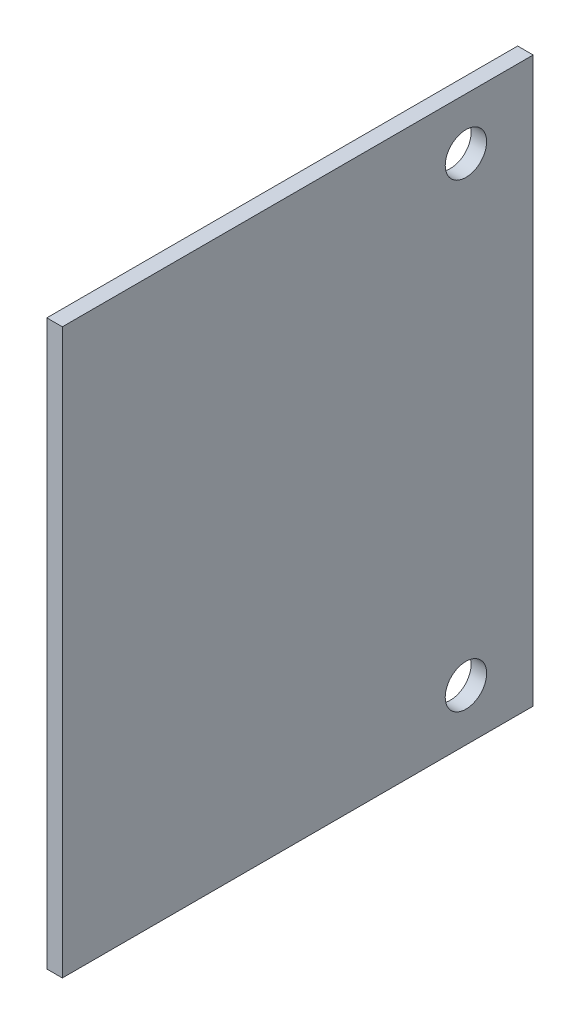
ISO-10303-21;
HEADER;
FILE_DESCRIPTION(('STEP AP214'),'2;1');
FILE_NAME('part.step','',(''),(''),'','','');
FILE_SCHEMA(('AUTOMOTIVE_DESIGN { 1 0 10303 214 1 1 1 1 }'));
ENDSEC;
DATA;
#1=APPLICATION_CONTEXT('core data for automotive mechanical design processes');
#2=APPLICATION_PROTOCOL_DEFINITION('international standard','automotive_design',2000,#1);
#3=PRODUCT_CONTEXT('',#1,'mechanical');
#4=PRODUCT('Part','Part','',(#3));
#5=PRODUCT_RELATED_PRODUCT_CATEGORY('part','',(#4));
#6=PRODUCT_DEFINITION_FORMATION('','',#4);
#7=PRODUCT_DEFINITION_CONTEXT('part definition',#1,'design');
#8=PRODUCT_DEFINITION('design','',#6,#7);
#9=PRODUCT_DEFINITION_SHAPE('','',#8);
#10=(LENGTH_UNIT() NAMED_UNIT(*) SI_UNIT(.MILLI.,.METRE.));
#11=(NAMED_UNIT(*) PLANE_ANGLE_UNIT() SI_UNIT($,.RADIAN.));
#12=(NAMED_UNIT(*) SI_UNIT($,.STERADIAN.) SOLID_ANGLE_UNIT());
#13=UNCERTAINTY_MEASURE_WITH_UNIT(LENGTH_MEASURE(1.E-05),#10,'distance_accuracy_value','');
#14=(GEOMETRIC_REPRESENTATION_CONTEXT(3) GLOBAL_UNCERTAINTY_ASSIGNED_CONTEXT((#13)) GLOBAL_UNIT_ASSIGNED_CONTEXT((#10,
#11,#12)) REPRESENTATION_CONTEXT('',''));
#15=CARTESIAN_POINT('',(0.,0.,0.));
#16=DIRECTION('',(0.,0.,1.));
#17=DIRECTION('',(1.,0.,0.));
#18=AXIS2_PLACEMENT_3D('',#15,#16,#17);
#19=CARTESIAN_POINT('',(-476.25,1289.36392571657,279.4));
#20=DIRECTION('',(1.,0.,0.));
#21=DIRECTION('',(0.,0.,-1.));
#22=AXIS2_PLACEMENT_3D('',#19,#20,#21);
#23=PLANE('',#22);
#24=CARTESIAN_POINT('',(-476.25,628.65,-215.9));
#25=DIRECTION('',(-1.,0.,0.));
#26=DIRECTION('',(0.,0.,1.));
#27=AXIS2_PLACEMENT_3D('',#24,#25,#26);
#28=CIRCLE('',#27,25.4);
#29=CARTESIAN_POINT('',(-476.25,628.65,-190.5));
#30=VERTEX_POINT('',#29);
#31=EDGE_CURVE('E136',#30,#30,#28,.T.);
#32=ORIENTED_EDGE('',*,*,#31,.F.);
#33=EDGE_LOOP('',(#32));
#34=FACE_BOUND('',#33,.T.);
#35=CARTESIAN_POINT('',(-476.25,63.5,-215.9));
#36=DIRECTION('',(-1.,0.,0.));
#37=DIRECTION('',(0.,0.,1.));
#38=AXIS2_PLACEMENT_3D('',#35,#36,#37);
#39=CIRCLE('',#38,25.4);
#40=CARTESIAN_POINT('',(-476.25,63.5,-190.5));
#41=VERTEX_POINT('',#40);
#42=EDGE_CURVE('E132',#41,#41,#39,.T.);
#43=ORIENTED_EDGE('',*,*,#42,.F.);
#44=EDGE_LOOP('',(#43));
#45=FACE_BOUND('',#44,.T.);
#46=DIRECTION('',(0.,0.,1.));
#47=VECTOR('',#46,1.);
#48=CARTESIAN_POINT('',(-476.25,692.15,279.4));
#49=LINE('',#48,#47);
#50=CARTESIAN_POINT('',(-476.25,692.15,-298.45));
#51=VERTEX_POINT('',#50);
#52=CARTESIAN_POINT('',(-476.25,692.15,279.4));
#53=VERTEX_POINT('',#52);
#54=EDGE_CURVE('E91',#51,#53,#49,.T.);
#55=ORIENTED_EDGE('',*,*,#54,.F.);
#56=DIRECTION('',(0.,-1.,0.));
#57=VECTOR('',#56,1.);
#58=CARTESIAN_POINT('',(-476.25,1289.36392571657,-298.45));
#59=LINE('',#58,#57);
#60=CARTESIAN_POINT('',(-476.25,0.,-298.45));
#61=VERTEX_POINT('',#60);
#62=EDGE_CURVE('E44',#51,#61,#59,.T.);
#63=ORIENTED_EDGE('',*,*,#62,.T.);
#64=DIRECTION('',(0.,0.,1.));
#65=VECTOR('',#64,1.);
#66=CARTESIAN_POINT('',(-476.25,0.,279.4));
#67=LINE('',#66,#65);
#68=CARTESIAN_POINT('',(-476.25,0.,279.4));
#69=VERTEX_POINT('',#68);
#70=EDGE_CURVE('E89',#61,#69,#67,.T.);
#71=ORIENTED_EDGE('',*,*,#70,.T.);
#72=DIRECTION('',(0.,-1.,0.));
#73=VECTOR('',#72,1.);
#74=CARTESIAN_POINT('',(-476.25,1289.36392571657,279.4));
#75=LINE('',#74,#73);
#76=EDGE_CURVE('E80',#53,#69,#75,.T.);
#77=ORIENTED_EDGE('',*,*,#76,.F.);
#78=EDGE_LOOP('',(#55,#63,#71,#77));
#79=FACE_BOUND('',#78,.T.);
#80=ADVANCED_FACE('F40',(#34,#45,#79),#23,.F.);
#81=CARTESIAN_POINT('',(-457.2,1289.36392571657,279.4));
#82=DIRECTION('',(0.,0.,-1.));
#83=DIRECTION('',(-1.,0.,0.));
#84=AXIS2_PLACEMENT_3D('',#81,#82,#83);
#85=PLANE('',#84);
#86=DIRECTION('',(1.,0.,0.));
#87=VECTOR('',#86,1.);
#88=CARTESIAN_POINT('',(-457.2,692.15,279.4));
#89=LINE('',#88,#87);
#90=CARTESIAN_POINT('',(-457.2,692.15,279.4));
#91=VERTEX_POINT('',#90);
#92=EDGE_CURVE('E50',#53,#91,#89,.T.);
#93=ORIENTED_EDGE('',*,*,#92,.F.);
#94=ORIENTED_EDGE('',*,*,#76,.T.);
#95=DIRECTION('',(1.,0.,0.));
#96=VECTOR('',#95,1.);
#97=CARTESIAN_POINT('',(-457.2,0.,279.4));
#98=LINE('',#97,#96);
#99=CARTESIAN_POINT('',(-457.2,0.,279.4));
#100=VERTEX_POINT('',#99);
#101=EDGE_CURVE('E104',#69,#100,#98,.T.);
#102=ORIENTED_EDGE('',*,*,#101,.T.);
#103=DIRECTION('',(0.,-1.,0.));
#104=VECTOR('',#103,1.);
#105=CARTESIAN_POINT('',(-457.2,1289.36392571657,279.4));
#106=LINE('',#105,#104);
#107=EDGE_CURVE('E119',#91,#100,#106,.T.);
#108=ORIENTED_EDGE('',*,*,#107,.F.);
#109=EDGE_LOOP('',(#93,#94,#102,#108));
#110=FACE_BOUND('',#109,.T.);
#111=ADVANCED_FACE('F157',(#110),#85,.F.);
#112=CARTESIAN_POINT('',(-457.2,1289.36392571657,-298.45));
#113=DIRECTION('',(-1.,0.,0.));
#114=DIRECTION('',(0.,0.,1.));
#115=AXIS2_PLACEMENT_3D('',#112,#113,#114);
#116=PLANE('',#115);
#117=CARTESIAN_POINT('',(-457.2,628.65,-215.9));
#118=DIRECTION('',(-1.,0.,0.));
#119=DIRECTION('',(0.,0.,1.));
#120=AXIS2_PLACEMENT_3D('',#117,#118,#119);
#121=CIRCLE('',#120,25.4);
#122=CARTESIAN_POINT('',(-457.2,628.65,-190.5));
#123=VERTEX_POINT('',#122);
#124=EDGE_CURVE('E94',#123,#123,#121,.T.);
#125=ORIENTED_EDGE('',*,*,#124,.T.);
#126=EDGE_LOOP('',(#125));
#127=FACE_BOUND('',#126,.T.);
#128=CARTESIAN_POINT('',(-457.2,63.5,-215.9));
#129=DIRECTION('',(-1.,0.,0.));
#130=DIRECTION('',(0.,0.,1.));
#131=AXIS2_PLACEMENT_3D('',#128,#129,#130);
#132=CIRCLE('',#131,25.4);
#133=CARTESIAN_POINT('',(-457.2,63.5,-190.5));
#134=VERTEX_POINT('',#133);
#135=EDGE_CURVE('E128',#134,#134,#132,.T.);
#136=ORIENTED_EDGE('',*,*,#135,.T.);
#137=EDGE_LOOP('',(#136));
#138=FACE_BOUND('',#137,.T.);
#139=DIRECTION('',(0.,0.,-1.));
#140=VECTOR('',#139,1.);
#141=CARTESIAN_POINT('',(-457.2,692.15,-298.45));
#142=LINE('',#141,#140);
#143=CARTESIAN_POINT('',(-457.2,692.15,-298.45));
#144=VERTEX_POINT('',#143);
#145=EDGE_CURVE('E12',#91,#144,#142,.T.);
#146=ORIENTED_EDGE('',*,*,#145,.F.);
#147=ORIENTED_EDGE('',*,*,#107,.T.);
#148=DIRECTION('',(0.,0.,-1.));
#149=VECTOR('',#148,1.);
#150=CARTESIAN_POINT('',(-457.2,0.,-298.45));
#151=LINE('',#150,#149);
#152=CARTESIAN_POINT('',(-457.2,0.,-298.45));
#153=VERTEX_POINT('',#152);
#154=EDGE_CURVE('E121',#100,#153,#151,.T.);
#155=ORIENTED_EDGE('',*,*,#154,.T.);
#156=DIRECTION('',(0.,-1.,0.));
#157=VECTOR('',#156,1.);
#158=CARTESIAN_POINT('',(-457.2,1289.36392571657,-298.45));
#159=LINE('',#158,#157);
#160=EDGE_CURVE('E63',#144,#153,#159,.T.);
#161=ORIENTED_EDGE('',*,*,#160,.F.);
#162=EDGE_LOOP('',(#146,#147,#155,#161));
#163=FACE_BOUND('',#162,.T.);
#164=ADVANCED_FACE('F145',(#127,#138,#163),#116,.F.);
#165=CARTESIAN_POINT('',(-476.25,1289.36392571657,-298.45));
#166=DIRECTION('',(0.,0.,1.));
#167=DIRECTION('',(1.,0.,0.));
#168=AXIS2_PLACEMENT_3D('',#165,#166,#167);
#169=PLANE('',#168);
#170=DIRECTION('',(-1.,0.,0.));
#171=VECTOR('',#170,1.);
#172=CARTESIAN_POINT('',(-476.25,692.15,-298.45));
#173=LINE('',#172,#171);
#174=EDGE_CURVE('E101',#144,#51,#173,.T.);
#175=ORIENTED_EDGE('',*,*,#174,.F.);
#176=ORIENTED_EDGE('',*,*,#160,.T.);
#177=DIRECTION('',(-1.,0.,0.));
#178=VECTOR('',#177,1.);
#179=CARTESIAN_POINT('',(-476.25,0.,-298.45));
#180=LINE('',#179,#178);
#181=EDGE_CURVE('E96',#153,#61,#180,.T.);
#182=ORIENTED_EDGE('',*,*,#181,.T.);
#183=ORIENTED_EDGE('',*,*,#62,.F.);
#184=EDGE_LOOP('',(#175,#176,#182,#183));
#185=FACE_BOUND('',#184,.T.);
#186=ADVANCED_FACE('F97',(#185),#169,.F.);
#187=CARTESIAN_POINT('',(0.,0.,0.));
#188=DIRECTION('',(0.,-1.,0.));
#189=DIRECTION('',(0.,0.,-1.));
#190=AXIS2_PLACEMENT_3D('',#187,#188,#189);
#191=PLANE('',#190);
#192=ORIENTED_EDGE('',*,*,#70,.F.);
#193=ORIENTED_EDGE('',*,*,#181,.F.);
#194=ORIENTED_EDGE('',*,*,#154,.F.);
#195=ORIENTED_EDGE('',*,*,#101,.F.);
#196=EDGE_LOOP('',(#192,#193,#194,#195));
#197=FACE_BOUND('',#196,.T.);
#198=ADVANCED_FACE('F103',(#197),#191,.T.);
#199=CARTESIAN_POINT('',(0.,692.15,0.));
#200=DIRECTION('',(0.,1.,0.));
#201=DIRECTION('',(0.,0.,1.));
#202=AXIS2_PLACEMENT_3D('',#199,#200,#201);
#203=PLANE('',#202);
#204=ORIENTED_EDGE('',*,*,#174,.T.);
#205=ORIENTED_EDGE('',*,*,#54,.T.);
#206=ORIENTED_EDGE('',*,*,#92,.T.);
#207=ORIENTED_EDGE('',*,*,#145,.T.);
#208=EDGE_LOOP('',(#204,#205,#206,#207));
#209=FACE_BOUND('',#208,.T.);
#210=ADVANCED_FACE('F42',(#209),#203,.T.);
#211=CARTESIAN_POINT('',(-457.2,63.5,-215.9));
#212=DIRECTION('',(-1.,0.,0.));
#213=DIRECTION('',(0.,0.,1.));
#214=AXIS2_PLACEMENT_3D('',#211,#212,#213);
#215=CYLINDRICAL_SURFACE('',#214,25.4);
#216=ORIENTED_EDGE('',*,*,#135,.F.);
#217=EDGE_LOOP('',(#216));
#218=FACE_BOUND('',#217,.T.);
#219=ORIENTED_EDGE('',*,*,#42,.T.);
#220=EDGE_LOOP('',(#219));
#221=FACE_BOUND('',#220,.T.);
#222=ADVANCED_FACE('F151',(#218,#221),#215,.F.);
#223=CARTESIAN_POINT('',(-457.2,628.65,-215.9));
#224=DIRECTION('',(-1.,0.,0.));
#225=DIRECTION('',(0.,0.,1.));
#226=AXIS2_PLACEMENT_3D('',#223,#224,#225);
#227=CYLINDRICAL_SURFACE('',#226,25.4);
#228=ORIENTED_EDGE('',*,*,#124,.F.);
#229=EDGE_LOOP('',(#228));
#230=FACE_BOUND('',#229,.T.);
#231=ORIENTED_EDGE('',*,*,#31,.T.);
#232=EDGE_LOOP('',(#231));
#233=FACE_BOUND('',#232,.T.);
#234=ADVANCED_FACE('F148',(#230,#233),#227,.F.);
#235=CLOSED_SHELL('',(#80,#111,#164,#186,#198,#210,#222,#234));
#236=MANIFOLD_SOLID_BREP('B2',#235);
#237=ADVANCED_BREP_SHAPE_REPRESENTATION('',(#18,#236),#14);
#238=SHAPE_DEFINITION_REPRESENTATION(#9,#237);
ENDSEC;
END-ISO-10303-21;
